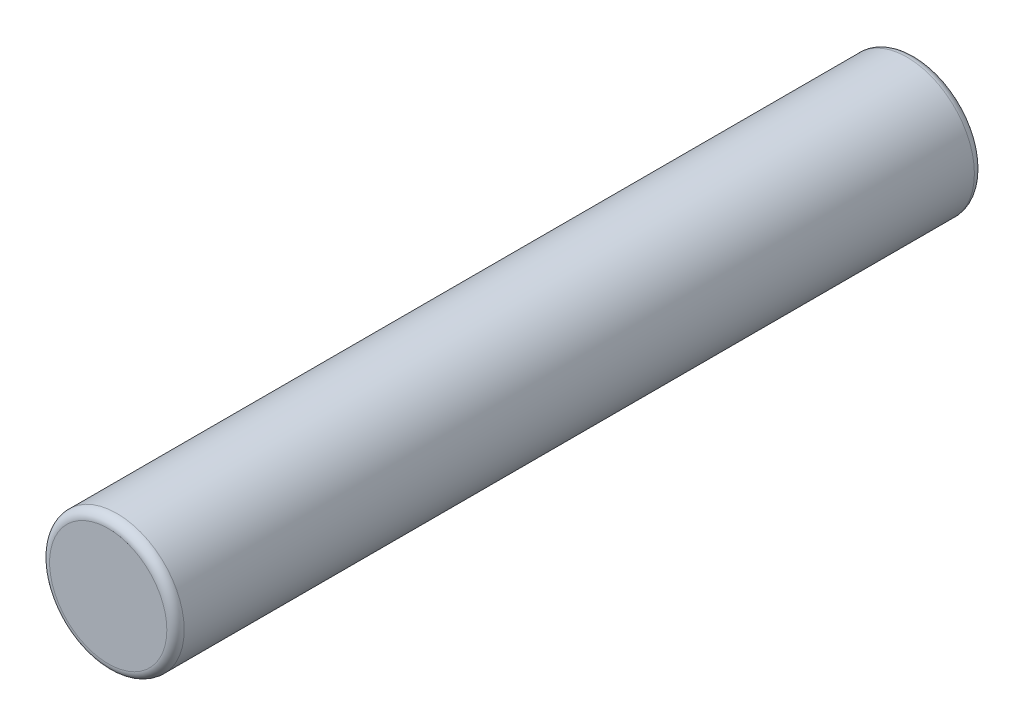
ISO-10303-21;
HEADER;
FILE_DESCRIPTION(('STEP AP214'),'2;1');
FILE_NAME('part.step','',(''),(''),'','','');
FILE_SCHEMA(('AUTOMOTIVE_DESIGN { 1 0 10303 214 1 1 1 1 }'));
ENDSEC;
DATA;
#1=APPLICATION_CONTEXT('core data for automotive mechanical design processes');
#2=APPLICATION_PROTOCOL_DEFINITION('international standard','automotive_design',2000,#1);
#3=PRODUCT_CONTEXT('',#1,'mechanical');
#4=PRODUCT('Part','Part','',(#3));
#5=PRODUCT_RELATED_PRODUCT_CATEGORY('part','',(#4));
#6=PRODUCT_DEFINITION_FORMATION('','',#4);
#7=PRODUCT_DEFINITION_CONTEXT('part definition',#1,'design');
#8=PRODUCT_DEFINITION('design','',#6,#7);
#9=PRODUCT_DEFINITION_SHAPE('','',#8);
#10=(LENGTH_UNIT() NAMED_UNIT(*) SI_UNIT(.MILLI.,.METRE.));
#11=(NAMED_UNIT(*) PLANE_ANGLE_UNIT() SI_UNIT($,.RADIAN.));
#12=(NAMED_UNIT(*) SI_UNIT($,.STERADIAN.) SOLID_ANGLE_UNIT());
#13=UNCERTAINTY_MEASURE_WITH_UNIT(LENGTH_MEASURE(1.E-05),#10,'distance_accuracy_value','');
#14=(GEOMETRIC_REPRESENTATION_CONTEXT(3) GLOBAL_UNCERTAINTY_ASSIGNED_CONTEXT((#13)) GLOBAL_UNIT_ASSIGNED_CONTEXT((#10,
#11,#12)) REPRESENTATION_CONTEXT('',''));
#15=CARTESIAN_POINT('',(0.,0.,0.));
#16=DIRECTION('',(0.,0.,1.));
#17=DIRECTION('',(1.,0.,0.));
#18=AXIS2_PLACEMENT_3D('',#15,#16,#17);
#19=CARTESIAN_POINT('',(0.,0.,19.05));
#20=DIRECTION('',(0.,0.,-1.));
#21=DIRECTION('',(-1.,0.,0.));
#22=AXIS2_PLACEMENT_3D('',#19,#20,#21);
#23=CYLINDRICAL_SURFACE('',#22,1.5875);
#24=CARTESIAN_POINT('',(0.,0.,0.20483870967742));
#25=DIRECTION('',(0.,0.,1.));
#26=DIRECTION('',(1.,0.,0.));
#27=AXIS2_PLACEMENT_3D('',#24,#25,#26);
#28=CIRCLE('',#27,1.5875);
#29=CARTESIAN_POINT('',(-1.5875,0.,0.20483870967742));
#30=VERTEX_POINT('',#29);
#31=EDGE_CURVE('E41',#30,#30,#28,.T.);
#32=CARTESIAN_POINT('',(0.,0.,18.8451612903226));
#33=DIRECTION('',(0.,0.,1.));
#34=DIRECTION('',(1.,0.,0.));
#35=AXIS2_PLACEMENT_3D('',#32,#33,#34);
#36=CIRCLE('',#35,1.5875);
#37=CARTESIAN_POINT('',(-1.5875,0.,18.8451612903226));
#38=VERTEX_POINT('',#37);
#39=EDGE_CURVE('E45',#38,#38,#36,.F.);
#40=CARTESIAN_POINT('',(-1.5875,0.,0.20483870967742));
#41=CARTESIAN_POINT('',(-1.5875,0.,0.399008736559141));
#42=CARTESIAN_POINT('',(-1.5875,0.,0.593178763440861));
#43=CARTESIAN_POINT('',(-1.5875,0.,0.981518817204303));
#44=CARTESIAN_POINT('',(-1.5875,0.,1.17568884408602));
#45=CARTESIAN_POINT('',(-1.5875,0.,1.56402889784946));
#46=CARTESIAN_POINT('',(-1.5875,0.,1.75819892473118));
#47=CARTESIAN_POINT('',(-1.5875,0.,2.14653897849462));
#48=CARTESIAN_POINT('',(-1.5875,0.,2.34070900537634));
#49=CARTESIAN_POINT('',(-1.5875,0.,2.72904905913979));
#50=CARTESIAN_POINT('',(-1.5875,0.,2.92321908602151));
#51=CARTESIAN_POINT('',(-1.5875,0.,3.31155913978495));
#52=CARTESIAN_POINT('',(-1.5875,0.,3.50572916666667));
#53=CARTESIAN_POINT('',(-1.5875,0.,3.89406922043011));
#54=CARTESIAN_POINT('',(-1.5875,0.,4.08823924731183));
#55=CARTESIAN_POINT('',(-1.5875,0.,4.47657930107527));
#56=CARTESIAN_POINT('',(-1.5875,0.,4.67074932795699));
#57=CARTESIAN_POINT('',(-1.5875,0.,5.05908938172043));
#58=CARTESIAN_POINT('',(-1.5875,0.,5.25325940860215));
#59=CARTESIAN_POINT('',(-1.5875,0.,5.64159946236559));
#60=CARTESIAN_POINT('',(-1.5875,0.,5.83576948924731));
#61=CARTESIAN_POINT('',(-1.5875,0.,6.22410954301075));
#62=CARTESIAN_POINT('',(-1.5875,0.,6.41827956989247));
#63=CARTESIAN_POINT('',(-1.5875,0.,6.80661962365591));
#64=CARTESIAN_POINT('',(-1.5875,0.,7.00078965053764));
#65=CARTESIAN_POINT('',(-1.5875,0.,7.38912970430108));
#66=CARTESIAN_POINT('',(-1.5875,0.,7.5832997311828));
#67=CARTESIAN_POINT('',(-1.5875,0.,7.97163978494624));
#68=CARTESIAN_POINT('',(-1.5875,0.,8.16580981182796));
#69=CARTESIAN_POINT('',(-1.5875,0.,8.5541498655914));
#70=CARTESIAN_POINT('',(-1.5875,0.,8.74831989247312));
#71=CARTESIAN_POINT('',(-1.5875,0.,9.13665994623656));
#72=CARTESIAN_POINT('',(-1.5875,0.,9.33082997311828));
#73=CARTESIAN_POINT('',(-1.5875,0.,9.71917002688172));
#74=CARTESIAN_POINT('',(-1.5875,0.,9.91334005376344));
#75=CARTESIAN_POINT('',(-1.5875,0.,10.3016801075269));
#76=CARTESIAN_POINT('',(-1.5875,0.,10.4958501344086));
#77=CARTESIAN_POINT('',(-1.5875,0.,10.884190188172));
#78=CARTESIAN_POINT('',(-1.5875,0.,11.0783602150538));
#79=CARTESIAN_POINT('',(-1.5875,0.,11.4667002688172));
#80=CARTESIAN_POINT('',(-1.5875,0.,11.6608702956989));
#81=CARTESIAN_POINT('',(-1.5875,0.,12.0492103494624));
#82=CARTESIAN_POINT('',(-1.5875,0.,12.2433803763441));
#83=CARTESIAN_POINT('',(-1.5875,0.,12.6317204301075));
#84=CARTESIAN_POINT('',(-1.5875,0.,12.8258904569892));
#85=CARTESIAN_POINT('',(-1.5875,0.,13.2142305107527));
#86=CARTESIAN_POINT('',(-1.5875,0.,13.4084005376344));
#87=CARTESIAN_POINT('',(-1.5875,0.,13.7967405913979));
#88=CARTESIAN_POINT('',(-1.5875,0.,13.9909106182796));
#89=CARTESIAN_POINT('',(-1.5875,0.,14.379250672043));
#90=CARTESIAN_POINT('',(-1.5875,0.,14.5734206989247));
#91=CARTESIAN_POINT('',(-1.5875,0.,14.9617607526882));
#92=CARTESIAN_POINT('',(-1.5875,0.,15.1559307795699));
#93=CARTESIAN_POINT('',(-1.5875,0.,15.5442708333333));
#94=CARTESIAN_POINT('',(-1.5875,0.,15.7384408602151));
#95=CARTESIAN_POINT('',(-1.5875,0.,16.1267809139785));
#96=CARTESIAN_POINT('',(-1.5875,0.,16.3209509408602));
#97=CARTESIAN_POINT('',(-1.5875,0.,16.7092909946237));
#98=CARTESIAN_POINT('',(-1.5875,0.,16.9034610215054));
#99=CARTESIAN_POINT('',(-1.5875,0.,17.2918010752688));
#100=CARTESIAN_POINT('',(-1.5875,0.,17.4859711021505));
#101=CARTESIAN_POINT('',(-1.5875,0.,17.874311155914));
#102=CARTESIAN_POINT('',(-1.5875,0.,18.0684811827957));
#103=CARTESIAN_POINT('',(-1.5875,0.,18.4568212365591));
#104=CARTESIAN_POINT('',(-1.5875,0.,18.6509912634409));
#105=CARTESIAN_POINT('',(-1.5875,0.,18.8451612903226));
#106=B_SPLINE_CURVE_WITH_KNOTS('',3,(#40,#41,#42,#43,#44,#45,#46,#47,#48,#49,#50,#51,#52,#53,
#54,#55,#56,#57,#58,#59,#60,#61,#62,#63,#64,#65,#66,#67,#68,#69,#70,#71,#72,#73,#74,#75,#76,#77,
#78,#79,#80,#81,#82,#83,#84,#85,#86,#87,#88,#89,#90,#91,#92,#93,#94,#95,#96,#97,#98,#99,#100,
#101,#102,#103,#104,#105),.UNSPECIFIED.,.F.,.F.,(4,2,2,2,2,2,2,2,2,2,2,2,2,2,2,2,2,2,2,2,2,2,2,
2,2,2,2,2,2,2,2,2,4),(0.,0.582510080645162,1.16502016129032,1.74753024193548,2.33004032258064,
2.91255040322581,3.49506048387097,4.07757056451613,4.66008064516129,5.24259072580645,
5.82510080645161,6.40761088709677,6.99012096774194,7.5726310483871,8.15514112903226,
8.73765120967742,9.32016129032258,9.90267137096774,10.4851814516129,11.0676915322581,
11.6502016129032,12.2327116935484,12.8152217741935,13.3977318548387,13.9802419354839,
14.562752016129,15.1452620967742,15.7277721774194,16.3102822580645,16.8927923387097,
17.4753024193548,18.0578125,18.6403225806452),.UNSPECIFIED.);
#107=EDGE_CURVE('BSEAM30',#30,#38,#106,.T.);
#108=ORIENTED_EDGE('',*,*,#31,.T.);
#109=ORIENTED_EDGE('',*,*,#39,.T.);
#110=ORIENTED_EDGE('',*,*,#107,.T.);
#111=ORIENTED_EDGE('',*,*,#107,.F.);
#112=EDGE_LOOP('',(#108,#110,#109,#111));
#113=FACE_BOUND('',#112,.T.);
#114=ADVANCED_FACE('F30',(#113),#23,.T.);
#115=CARTESIAN_POINT('',(0.,0.,19.05));
#116=DIRECTION('',(0.,0.,1.));
#117=DIRECTION('',(1.,0.,0.));
#118=AXIS2_PLACEMENT_3D('',#115,#116,#117);
#119=PLANE('',#118);
#120=CARTESIAN_POINT('',(0.,0.,19.05));
#121=DIRECTION('',(0.,0.,1.));
#122=DIRECTION('',(1.,0.,0.));
#123=AXIS2_PLACEMENT_3D('',#120,#121,#122);
#124=CIRCLE('',#123,1.38266129032258);
#125=CARTESIAN_POINT('',(1.38266129032258,0.,19.05));
#126=VERTEX_POINT('',#125);
#127=EDGE_CURVE('E10',#126,#126,#124,.T.);
#128=ORIENTED_EDGE('',*,*,#127,.T.);
#129=EDGE_LOOP('',(#128));
#130=FACE_BOUND('',#129,.T.);
#131=ADVANCED_FACE('F61',(#130),#119,.T.);
#132=CARTESIAN_POINT('',(0.,0.,0.));
#133=DIRECTION('',(0.,0.,1.));
#134=DIRECTION('',(1.,0.,0.));
#135=AXIS2_PLACEMENT_3D('',#132,#133,#134);
#136=PLANE('',#135);
#137=CARTESIAN_POINT('',(0.,0.,0.));
#138=DIRECTION('',(0.,0.,1.));
#139=DIRECTION('',(1.,0.,0.));
#140=AXIS2_PLACEMENT_3D('',#137,#138,#139);
#141=CIRCLE('',#140,1.38266129032258);
#142=CARTESIAN_POINT('',(1.38266129032258,0.,0.));
#143=VERTEX_POINT('',#142);
#144=EDGE_CURVE('E37',#143,#143,#141,.F.);
#145=ORIENTED_EDGE('',*,*,#144,.T.);
#146=EDGE_LOOP('',(#145));
#147=FACE_BOUND('',#146,.T.);
#148=ADVANCED_FACE('F58',(#147),#136,.F.);
#149=CARTESIAN_POINT('',(0.,0.,0.20483870967742));
#150=DIRECTION('',(0.,0.,1.));
#151=DIRECTION('',(1.,0.,0.));
#152=AXIS2_PLACEMENT_3D('',#149,#150,#151);
#153=TOROIDAL_SURFACE('',#152,1.38266129032258,0.204838709677419);
#154=ORIENTED_EDGE('',*,*,#144,.F.);
#155=EDGE_LOOP('',(#154));
#156=FACE_BOUND('',#155,.T.);
#157=ORIENTED_EDGE('',*,*,#31,.F.);
#158=EDGE_LOOP('',(#157));
#159=FACE_BOUND('',#158,.T.);
#160=ADVANCED_FACE('F54',(#156,#159),#153,.T.);
#161=CARTESIAN_POINT('',(0.,0.,18.8451612903226));
#162=DIRECTION('',(0.,0.,1.));
#163=DIRECTION('',(1.,0.,0.));
#164=AXIS2_PLACEMENT_3D('',#161,#162,#163);
#165=TOROIDAL_SURFACE('',#164,1.38266129032258,0.204838709677419);
#166=ORIENTED_EDGE('',*,*,#39,.F.);
#167=EDGE_LOOP('',(#166));
#168=FACE_BOUND('',#167,.T.);
#169=ORIENTED_EDGE('',*,*,#127,.F.);
#170=EDGE_LOOP('',(#169));
#171=FACE_BOUND('',#170,.T.);
#172=ADVANCED_FACE('F32',(#168,#171),#165,.T.);
#173=CLOSED_SHELL('',(#114,#131,#148,#160,#172));
#174=MANIFOLD_SOLID_BREP('B2',#173);
#175=ADVANCED_BREP_SHAPE_REPRESENTATION('',(#18,#174),#14);
#176=SHAPE_DEFINITION_REPRESENTATION(#9,#175);
ENDSEC;
END-ISO-10303-21;
